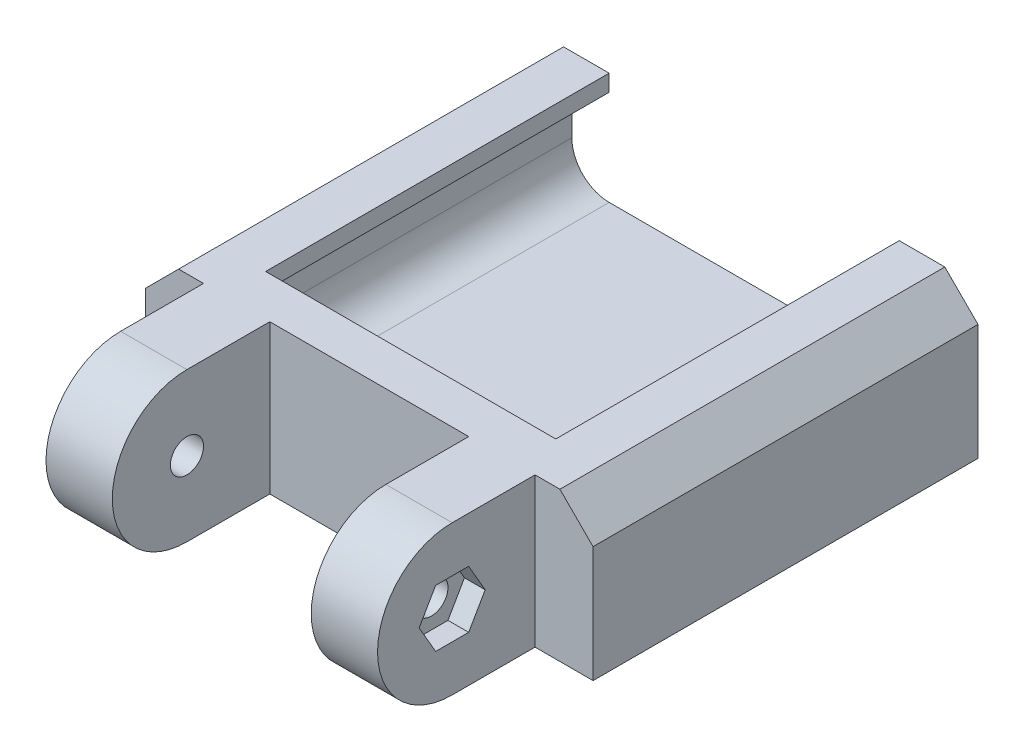
ISO-10303-21;
HEADER;
FILE_DESCRIPTION(('STEP AP214'),'2;1');
FILE_NAME('part.step','',(''),(''),'','','');
FILE_SCHEMA(('AUTOMOTIVE_DESIGN { 1 0 10303 214 1 1 1 1 }'));
ENDSEC;
DATA;
#1=APPLICATION_CONTEXT('core data for automotive mechanical design processes');
#2=APPLICATION_PROTOCOL_DEFINITION('international standard','automotive_design',2000,#1);
#3=PRODUCT_CONTEXT('',#1,'mechanical');
#4=PRODUCT('Part','Part','',(#3));
#5=PRODUCT_RELATED_PRODUCT_CATEGORY('part','',(#4));
#6=PRODUCT_DEFINITION_FORMATION('','',#4);
#7=PRODUCT_DEFINITION_CONTEXT('part definition',#1,'design');
#8=PRODUCT_DEFINITION('design','',#6,#7);
#9=PRODUCT_DEFINITION_SHAPE('','',#8);
#10=(LENGTH_UNIT() NAMED_UNIT(*) SI_UNIT(.MILLI.,.METRE.));
#11=(NAMED_UNIT(*) PLANE_ANGLE_UNIT() SI_UNIT($,.RADIAN.));
#12=(NAMED_UNIT(*) SI_UNIT($,.STERADIAN.) SOLID_ANGLE_UNIT());
#13=UNCERTAINTY_MEASURE_WITH_UNIT(LENGTH_MEASURE(1.E-05),#10,'distance_accuracy_value','');
#14=(GEOMETRIC_REPRESENTATION_CONTEXT(3) GLOBAL_UNCERTAINTY_ASSIGNED_CONTEXT((#13)) GLOBAL_UNIT_ASSIGNED_CONTEXT((#10,
#11,#12)) REPRESENTATION_CONTEXT('',''));
#15=CARTESIAN_POINT('',(0.,0.,0.));
#16=DIRECTION('',(0.,0.,1.));
#17=DIRECTION('',(1.,0.,0.));
#18=AXIS2_PLACEMENT_3D('',#15,#16,#17);
#19=CARTESIAN_POINT('',(-20.,9.49999999999999,48.916410101364));
#20=DIRECTION('',(-1.,0.,0.));
#21=DIRECTION('',(0.,0.,1.));
#22=AXIS2_PLACEMENT_3D('',#19,#20,#21);
#23=CYLINDRICAL_SURFACE('',#22,1.99999999999999);
#24=CARTESIAN_POINT('',(12.,9.49999999999999,48.916410101364));
#25=DIRECTION('',(1.,0.,0.));
#26=DIRECTION('',(0.,1.,0.));
#27=AXIS2_PLACEMENT_3D('',#24,#25,#26);
#28=CIRCLE('',#27,1.99999999999999);
#29=CARTESIAN_POINT('',(12.,11.5,48.916410101364));
#30=VERTEX_POINT('',#29);
#31=EDGE_CURVE('E305',#30,#30,#28,.T.);
#32=ORIENTED_EDGE('',*,*,#31,.F.);
#33=EDGE_LOOP('',(#32));
#34=FACE_BOUND('',#33,.T.);
#35=CARTESIAN_POINT('',(17.5,9.49999999999999,48.916410101364));
#36=DIRECTION('',(1.,0.,0.));
#37=DIRECTION('',(0.,0.,-1.));
#38=AXIS2_PLACEMENT_3D('',#35,#36,#37);
#39=CIRCLE('',#38,1.99999999999999);
#40=CARTESIAN_POINT('',(17.5,9.49999999999999,46.916410101364));
#41=VERTEX_POINT('',#40);
#42=EDGE_CURVE('E49',#41,#41,#39,.F.);
#43=ORIENTED_EDGE('',*,*,#42,.F.);
#44=EDGE_LOOP('',(#43));
#45=FACE_BOUND('',#44,.T.);
#46=ADVANCED_FACE('F45',(#34,#45),#23,.F.);
#47=CARTESIAN_POINT('',(20.,18.5,48.916410101364));
#48=DIRECTION('',(-1.,0.,0.));
#49=DIRECTION('',(0.,-1.,0.));
#50=AXIS2_PLACEMENT_3D('',#47,#48,#49);
#51=PLANE('',#50);
#52=DIRECTION('',(0.,0.866025403784439,0.499999999999999));
#53=VECTOR('',#52,1.);
#54=CARTESIAN_POINT('',(20.,9.49999999999998,44.9326932439556));
#55=LINE('',#54,#53);
#56=CARTESIAN_POINT('',(20.,9.49999999999998,44.9326932439556));
#57=VERTEX_POINT('',#56);
#58=CARTESIAN_POINT('',(20.,12.95,46.9245516726598));
#59=VERTEX_POINT('',#58);
#60=EDGE_CURVE('E279',#57,#59,#55,.T.);
#61=ORIENTED_EDGE('',*,*,#60,.F.);
#62=DIRECTION('',(0.,0.866025403784439,-0.5));
#63=VECTOR('',#62,1.);
#64=CARTESIAN_POINT('',(20.,6.04999999999999,46.9245516726598));
#65=LINE('',#64,#63);
#66=CARTESIAN_POINT('',(20.,6.04999999999999,46.9245516726598));
#67=VERTEX_POINT('',#66);
#68=EDGE_CURVE('E62',#67,#57,#65,.T.);
#69=ORIENTED_EDGE('',*,*,#68,.F.);
#70=DIRECTION('',(0.,0.,-1.));
#71=VECTOR('',#70,1.);
#72=CARTESIAN_POINT('',(20.,6.04999999999999,50.9082685300682));
#73=LINE('',#72,#71);
#74=CARTESIAN_POINT('',(20.,6.04999999999999,50.9082685300682));
#75=VERTEX_POINT('',#74);
#76=EDGE_CURVE('E265',#75,#67,#73,.T.);
#77=ORIENTED_EDGE('',*,*,#76,.F.);
#78=DIRECTION('',(0.,-0.866025403784439,-0.499999999999999));
#79=VECTOR('',#78,1.);
#80=CARTESIAN_POINT('',(20.,9.49999999999999,52.9001269587724));
#81=LINE('',#80,#79);
#82=CARTESIAN_POINT('',(20.,9.49999999999999,52.9001269587724));
#83=VERTEX_POINT('',#82);
#84=EDGE_CURVE('E268',#83,#75,#81,.T.);
#85=ORIENTED_EDGE('',*,*,#84,.F.);
#86=DIRECTION('',(0.,-0.866025403784439,0.499999999999999));
#87=VECTOR('',#86,1.);
#88=CARTESIAN_POINT('',(20.,12.95,50.9082685300682));
#89=LINE('',#88,#87);
#90=CARTESIAN_POINT('',(20.,12.95,50.9082685300682));
#91=VERTEX_POINT('',#90);
#92=EDGE_CURVE('E284',#91,#83,#89,.T.);
#93=ORIENTED_EDGE('',*,*,#92,.F.);
#94=DIRECTION('',(0.,0.,1.));
#95=VECTOR('',#94,1.);
#96=CARTESIAN_POINT('',(20.,12.95,46.9245516726598));
#97=LINE('',#96,#95);
#98=EDGE_CURVE('E281',#59,#91,#97,.T.);
#99=ORIENTED_EDGE('',*,*,#98,.F.);
#100=EDGE_LOOP('',(#61,#69,#77,#85,#93,#99));
#101=FACE_BOUND('',#100,.T.);
#102=DIRECTION('',(0.,1.,0.));
#103=VECTOR('',#102,1.);
#104=CARTESIAN_POINT('',(20.,18.5,38.916410101364));
#105=LINE('',#104,#103);
#106=CARTESIAN_POINT('',(20.,0.5,38.916410101364));
#107=VERTEX_POINT('',#106);
#108=CARTESIAN_POINT('',(20.,18.5,38.916410101364));
#109=VERTEX_POINT('',#108);
#110=EDGE_CURVE('E358',#107,#109,#105,.T.);
#111=ORIENTED_EDGE('',*,*,#110,.T.);
#112=DIRECTION('',(0.,0.,-1.));
#113=VECTOR('',#112,1.);
#114=CARTESIAN_POINT('',(20.,18.5,48.916410101364));
#115=LINE('',#114,#113);
#116=CARTESIAN_POINT('',(20.,18.5,48.916410101364));
#117=VERTEX_POINT('',#116);
#118=EDGE_CURVE('E351',#117,#109,#115,.T.);
#119=ORIENTED_EDGE('',*,*,#118,.F.);
#120=CARTESIAN_POINT('',(20.,9.5,48.916410101364));
#121=DIRECTION('',(1.,0.,0.));
#122=DIRECTION('',(0.,1.,0.));
#123=AXIS2_PLACEMENT_3D('',#120,#121,#122);
#124=CIRCLE('',#123,9.00000000000001);
#125=CARTESIAN_POINT('',(20.,0.5,48.916410101364));
#126=VERTEX_POINT('',#125);
#127=EDGE_CURVE('E312',#117,#126,#124,.T.);
#128=ORIENTED_EDGE('',*,*,#127,.T.);
#129=DIRECTION('',(0.,0.,-1.));
#130=VECTOR('',#129,1.);
#131=CARTESIAN_POINT('',(20.,0.5,48.916410101364));
#132=LINE('',#131,#130);
#133=EDGE_CURVE('E348',#126,#107,#132,.T.);
#134=ORIENTED_EDGE('',*,*,#133,.T.);
#135=EDGE_LOOP('',(#111,#119,#128,#134));
#136=FACE_BOUND('',#135,.T.);
#137=ADVANCED_FACE('F521',(#101,#136),#51,.F.);
#138=CARTESIAN_POINT('',(-30.5,0.,38.916410101364));
#139=DIRECTION('',(0.,0.,-1.));
#140=DIRECTION('',(-1.,0.,0.));
#141=AXIS2_PLACEMENT_3D('',#138,#139,#140);
#142=PLANE('',#141);
#143=DIRECTION('',(0.,-1.,0.));
#144=VECTOR('',#143,1.);
#145=CARTESIAN_POINT('',(-20.,18.5,38.916410101364));
#146=LINE('',#145,#144);
#147=CARTESIAN_POINT('',(-20.,18.5,38.916410101364));
#148=VERTEX_POINT('',#147);
#149=CARTESIAN_POINT('',(-20.,0.5,38.916410101364));
#150=VERTEX_POINT('',#149);
#151=EDGE_CURVE('E329',#148,#150,#146,.T.);
#152=ORIENTED_EDGE('',*,*,#151,.F.);
#153=DIRECTION('',(-1.,0.,0.));
#154=VECTOR('',#153,1.);
#155=CARTESIAN_POINT('',(-27.,18.5,38.916410101364));
#156=LINE('',#155,#154);
#157=CARTESIAN_POINT('',(-23.,18.5,38.916410101364));
#158=VERTEX_POINT('',#157);
#159=EDGE_CURVE('E450',#148,#158,#156,.T.);
#160=ORIENTED_EDGE('',*,*,#159,.T.);
#161=DIRECTION('',(0.707106781186548,0.707106781186548,0.));
#162=VECTOR('',#161,1.);
#163=CARTESIAN_POINT('',(-23.,18.5,38.916410101364));
#164=LINE('',#163,#162);
#165=CARTESIAN_POINT('',(-27.,14.5,38.916410101364));
#166=VERTEX_POINT('',#165);
#167=EDGE_CURVE('E478',#158,#166,#164,.F.);
#168=ORIENTED_EDGE('',*,*,#167,.T.);
#169=DIRECTION('',(0.,-1.,0.));
#170=VECTOR('',#169,1.);
#171=CARTESIAN_POINT('',(-27.,5.,38.916410101364));
#172=LINE('',#171,#170);
#173=CARTESIAN_POINT('',(-27.,0.5,38.916410101364));
#174=VERTEX_POINT('',#173);
#175=EDGE_CURVE('E448',#166,#174,#172,.T.);
#176=ORIENTED_EDGE('',*,*,#175,.T.);
#177=DIRECTION('',(-1.,0.,0.));
#178=VECTOR('',#177,1.);
#179=CARTESIAN_POINT('',(-28.,0.5,38.916410101364));
#180=LINE('',#179,#178);
#181=EDGE_CURVE('E70',#150,#174,#180,.T.);
#182=ORIENTED_EDGE('',*,*,#181,.F.);
#183=EDGE_LOOP('',(#152,#160,#168,#176,#182));
#184=FACE_BOUND('',#183,.T.);
#185=ADVANCED_FACE('F526',(#184),#142,.F.);
#186=DIRECTION('',(0.,1.,0.));
#187=VECTOR('',#186,1.);
#188=CARTESIAN_POINT('',(-12.,18.5,38.916410101364));
#189=LINE('',#188,#187);
#190=CARTESIAN_POINT('',(-12.,0.5,38.916410101364));
#191=VERTEX_POINT('',#190);
#192=CARTESIAN_POINT('',(-12.,18.5,38.916410101364));
#193=VERTEX_POINT('',#192);
#194=EDGE_CURVE('E325',#191,#193,#189,.T.);
#195=ORIENTED_EDGE('',*,*,#194,.F.);
#196=CARTESIAN_POINT('',(12.,0.5,38.916410101364));
#197=VERTEX_POINT('',#196);
#198=EDGE_CURVE('E476',#197,#191,#180,.T.);
#199=ORIENTED_EDGE('',*,*,#198,.F.);
#200=DIRECTION('',(0.,-1.,0.));
#201=VECTOR('',#200,1.);
#202=CARTESIAN_POINT('',(12.,18.5,38.916410101364));
#203=LINE('',#202,#201);
#204=CARTESIAN_POINT('',(12.,18.5,38.916410101364));
#205=VERTEX_POINT('',#204);
#206=EDGE_CURVE('E332',#205,#197,#203,.T.);
#207=ORIENTED_EDGE('',*,*,#206,.F.);
#208=EDGE_CURVE('E449',#205,#193,#156,.T.);
#209=ORIENTED_EDGE('',*,*,#208,.T.);
#210=EDGE_LOOP('',(#195,#199,#207,#209));
#211=FACE_BOUND('',#210,.T.);
#212=ADVANCED_FACE('F662',(#211),#142,.F.);
#213=ORIENTED_EDGE('',*,*,#110,.F.);
#214=CARTESIAN_POINT('',(27.,0.5,38.916410101364));
#215=VERTEX_POINT('',#214);
#216=EDGE_CURVE('E472',#215,#107,#180,.T.);
#217=ORIENTED_EDGE('',*,*,#216,.F.);
#218=DIRECTION('',(0.,1.,0.));
#219=VECTOR('',#218,1.);
#220=CARTESIAN_POINT('',(27.,18.5,38.916410101364));
#221=LINE('',#220,#219);
#222=CARTESIAN_POINT('',(27.,14.5,38.916410101364));
#223=VERTEX_POINT('',#222);
#224=EDGE_CURVE('E464',#215,#223,#221,.T.);
#225=ORIENTED_EDGE('',*,*,#224,.T.);
#226=DIRECTION('',(0.707106781186548,-0.707106781186548,0.));
#227=VECTOR('',#226,1.);
#228=CARTESIAN_POINT('',(27.,14.5,38.916410101364));
#229=LINE('',#228,#227);
#230=CARTESIAN_POINT('',(23.,18.5,38.916410101364));
#231=VERTEX_POINT('',#230);
#232=EDGE_CURVE('E480',#223,#231,#229,.F.);
#233=ORIENTED_EDGE('',*,*,#232,.T.);
#234=EDGE_CURVE('E446',#231,#109,#156,.T.);
#235=ORIENTED_EDGE('',*,*,#234,.T.);
#236=EDGE_LOOP('',(#213,#217,#225,#233,#235));
#237=FACE_BOUND('',#236,.T.);
#238=ADVANCED_FACE('F664',(#237),#142,.F.);
#239=CARTESIAN_POINT('',(0.,5.,0.));
#240=DIRECTION('',(0.,1.,0.));
#241=DIRECTION('',(0.,0.,1.));
#242=AXIS2_PLACEMENT_3D('',#239,#240,#241);
#243=PLANE('',#242);
#244=DIRECTION('',(0.,0.,1.));
#245=VECTOR('',#244,1.);
#246=CARTESIAN_POINT('',(-17.5,5.,38.916410101364));
#247=LINE('',#246,#245);
#248=CARTESIAN_POINT('',(-17.5,5.,-7.52264068711072));
#249=VERTEX_POINT('',#248);
#250=CARTESIAN_POINT('',(-17.5,5.,33.916410101364));
#251=VERTEX_POINT('',#250);
#252=EDGE_CURVE('E492',#249,#251,#247,.T.);
#253=ORIENTED_EDGE('',*,*,#252,.T.);
#254=DIRECTION('',(1.,0.,0.));
#255=VECTOR('',#254,1.);
#256=CARTESIAN_POINT('',(0.,5.,33.916410101364));
#257=LINE('',#256,#255);
#258=CARTESIAN_POINT('',(17.5,5.,33.916410101364));
#259=VERTEX_POINT('',#258);
#260=EDGE_CURVE('E373',#251,#259,#257,.T.);
#261=ORIENTED_EDGE('',*,*,#260,.T.);
#262=DIRECTION('',(0.,0.,1.));
#263=VECTOR('',#262,1.);
#264=CARTESIAN_POINT('',(17.5,5.,2.47735931288928));
#265=LINE('',#264,#263);
#266=CARTESIAN_POINT('',(17.5,5.,-7.52264068711072));
#267=VERTEX_POINT('',#266);
#268=EDGE_CURVE('E490',#259,#267,#265,.F.);
#269=ORIENTED_EDGE('',*,*,#268,.T.);
#270=DIRECTION('',(1.,0.,0.));
#271=VECTOR('',#270,1.);
#272=CARTESIAN_POINT('',(-17.5,5.,-7.52264068711072));
#273=LINE('',#272,#271);
#274=EDGE_CURVE('E423',#249,#267,#273,.T.);
#275=ORIENTED_EDGE('',*,*,#274,.F.);
#276=EDGE_LOOP('',(#253,#261,#269,#275));
#277=FACE_BOUND('',#276,.T.);
#278=ADVANCED_FACE('F681',(#277),#243,.T.);
#279=CARTESIAN_POINT('',(22.,5.,-15.083589898636));
#280=DIRECTION('',(-1.,0.,0.));
#281=DIRECTION('',(0.,0.,1.));
#282=AXIS2_PLACEMENT_3D('',#279,#280,#281);
#283=PLANE('',#282);
#284=DIRECTION('',(0.,0.,1.));
#285=VECTOR('',#284,1.);
#286=CARTESIAN_POINT('',(22.,9.5,38.916410101364));
#287=LINE('',#286,#285);
#288=CARTESIAN_POINT('',(22.,9.5,-7.52264068711072));
#289=VERTEX_POINT('',#288);
#290=CARTESIAN_POINT('',(22.,9.5,33.916410101364));
#291=VERTEX_POINT('',#290);
#292=EDGE_CURVE('E54',#289,#291,#287,.T.);
#293=ORIENTED_EDGE('',*,*,#292,.T.);
#294=DIRECTION('',(0.,1.,0.));
#295=VECTOR('',#294,1.);
#296=CARTESIAN_POINT('',(22.,5.,33.916410101364));
#297=LINE('',#296,#295);
#298=CARTESIAN_POINT('',(22.,16.5,33.916410101364));
#299=VERTEX_POINT('',#298);
#300=EDGE_CURVE('E370',#291,#299,#297,.T.);
#301=ORIENTED_EDGE('',*,*,#300,.T.);
#302=DIRECTION('',(0.,0.,1.));
#303=VECTOR('',#302,1.);
#304=CARTESIAN_POINT('',(22.,16.5,-15.083589898636));
#305=LINE('',#304,#303);
#306=CARTESIAN_POINT('',(22.,16.5,-7.52264068711072));
#307=VERTEX_POINT('',#306);
#308=EDGE_CURVE('E445',#307,#299,#305,.T.);
#309=ORIENTED_EDGE('',*,*,#308,.F.);
#310=DIRECTION('',(0.,1.,0.));
#311=VECTOR('',#310,1.);
#312=CARTESIAN_POINT('',(22.,9.5,-7.52264068711072));
#313=LINE('',#312,#311);
#314=EDGE_CURVE('E429',#289,#307,#313,.T.);
#315=ORIENTED_EDGE('',*,*,#314,.F.);
#316=EDGE_LOOP('',(#293,#301,#309,#315));
#317=FACE_BOUND('',#316,.T.);
#318=ADVANCED_FACE('F702',(#317),#283,.T.);
#319=CARTESIAN_POINT('',(22.,16.5,-15.083589898636));
#320=DIRECTION('',(0.,-1.,0.));
#321=DIRECTION('',(1.,0.,0.));
#322=AXIS2_PLACEMENT_3D('',#319,#320,#321);
#323=PLANE('',#322);
#324=ORIENTED_EDGE('',*,*,#308,.T.);
#325=DIRECTION('',(-1.,0.,0.));
#326=VECTOR('',#325,1.);
#327=CARTESIAN_POINT('',(22.,16.5,33.916410101364));
#328=LINE('',#327,#326);
#329=CARTESIAN_POINT('',(17.5,16.5,33.916410101364));
#330=VERTEX_POINT('',#329);
#331=EDGE_CURVE('E387',#299,#330,#328,.T.);
#332=ORIENTED_EDGE('',*,*,#331,.T.);
#333=DIRECTION('',(0.,0.,1.));
#334=VECTOR('',#333,1.);
#335=CARTESIAN_POINT('',(17.5,16.5,-15.083589898636));
#336=LINE('',#335,#334);
#337=CARTESIAN_POINT('',(17.5,16.5,-7.52264068711072));
#338=VERTEX_POINT('',#337);
#339=EDGE_CURVE('E465',#338,#330,#336,.T.);
#340=ORIENTED_EDGE('',*,*,#339,.F.);
#341=DIRECTION('',(-1.,0.,0.));
#342=VECTOR('',#341,1.);
#343=CARTESIAN_POINT('',(22.,16.5,-7.52264068711072));
#344=LINE('',#343,#342);
#345=EDGE_CURVE('E432',#307,#338,#344,.T.);
#346=ORIENTED_EDGE('',*,*,#345,.F.);
#347=EDGE_LOOP('',(#324,#332,#340,#346));
#348=FACE_BOUND('',#347,.T.);
#349=ADVANCED_FACE('F715',(#348),#323,.T.);
#350=CARTESIAN_POINT('',(17.5,16.5,-15.083589898636));
#351=DIRECTION('',(-1.,0.,0.));
#352=DIRECTION('',(0.,-1.,0.));
#353=AXIS2_PLACEMENT_3D('',#350,#351,#352);
#354=PLANE('',#353);
#355=ORIENTED_EDGE('',*,*,#339,.T.);
#356=DIRECTION('',(0.,1.,0.));
#357=VECTOR('',#356,1.);
#358=CARTESIAN_POINT('',(17.5,16.5,33.916410101364));
#359=LINE('',#358,#357);
#360=CARTESIAN_POINT('',(17.5,18.5,33.916410101364));
#361=VERTEX_POINT('',#360);
#362=EDGE_CURVE('E390',#330,#361,#359,.T.);
#363=ORIENTED_EDGE('',*,*,#362,.T.);
#364=DIRECTION('',(0.,0.,1.));
#365=VECTOR('',#364,1.);
#366=CARTESIAN_POINT('',(17.5,18.5,-15.083589898636));
#367=LINE('',#366,#365);
#368=CARTESIAN_POINT('',(17.5,18.5,-7.52264068711072));
#369=VERTEX_POINT('',#368);
#370=EDGE_CURVE('E461',#369,#361,#367,.T.);
#371=ORIENTED_EDGE('',*,*,#370,.F.);
#372=DIRECTION('',(0.,1.,0.));
#373=VECTOR('',#372,1.);
#374=CARTESIAN_POINT('',(17.5,16.5,-7.52264068711072));
#375=LINE('',#374,#373);
#376=EDGE_CURVE('E435',#338,#369,#375,.T.);
#377=ORIENTED_EDGE('',*,*,#376,.F.);
#378=EDGE_LOOP('',(#355,#363,#371,#377));
#379=FACE_BOUND('',#378,.T.);
#380=ADVANCED_FACE('F727',(#379),#354,.T.);
#381=CARTESIAN_POINT('',(-17.5,18.5,-15.083589898636));
#382=DIRECTION('',(1.,0.,0.));
#383=DIRECTION('',(0.,1.,0.));
#384=AXIS2_PLACEMENT_3D('',#381,#382,#383);
#385=PLANE('',#384);
#386=DIRECTION('',(0.,0.,1.));
#387=VECTOR('',#386,1.);
#388=CARTESIAN_POINT('',(-17.5,18.5,-15.083589898636));
#389=LINE('',#388,#387);
#390=CARTESIAN_POINT('',(-17.5,18.5,-7.52264068711072));
#391=VERTEX_POINT('',#390);
#392=CARTESIAN_POINT('',(-17.5,18.5,33.916410101364));
#393=VERTEX_POINT('',#392);
#394=EDGE_CURVE('E453',#391,#393,#389,.T.);
#395=ORIENTED_EDGE('',*,*,#394,.T.);
#396=DIRECTION('',(0.,-1.,0.));
#397=VECTOR('',#396,1.);
#398=CARTESIAN_POINT('',(-17.5,18.5,33.916410101364));
#399=LINE('',#398,#397);
#400=CARTESIAN_POINT('',(-17.5,16.5,33.916410101364));
#401=VERTEX_POINT('',#400);
#402=EDGE_CURVE('E384',#393,#401,#399,.T.);
#403=ORIENTED_EDGE('',*,*,#402,.T.);
#404=DIRECTION('',(0.,0.,1.));
#405=VECTOR('',#404,1.);
#406=CARTESIAN_POINT('',(-17.5,16.5,-15.083589898636));
#407=LINE('',#406,#405);
#408=CARTESIAN_POINT('',(-17.5,16.5,-7.52264068711072));
#409=VERTEX_POINT('',#408);
#410=EDGE_CURVE('E456',#409,#401,#407,.T.);
#411=ORIENTED_EDGE('',*,*,#410,.F.);
#412=DIRECTION('',(0.,-1.,0.));
#413=VECTOR('',#412,1.);
#414=CARTESIAN_POINT('',(-17.5,18.5,-7.52264068711072));
#415=LINE('',#414,#413);
#416=EDGE_CURVE('E411',#391,#409,#415,.T.);
#417=ORIENTED_EDGE('',*,*,#416,.F.);
#418=EDGE_LOOP('',(#395,#403,#411,#417));
#419=FACE_BOUND('',#418,.T.);
#420=ADVANCED_FACE('F738',(#419),#385,.T.);
#421=CARTESIAN_POINT('',(-17.5,16.5,-15.083589898636));
#422=DIRECTION('',(0.,-1.,0.));
#423=DIRECTION('',(1.,0.,0.));
#424=AXIS2_PLACEMENT_3D('',#421,#422,#423);
#425=PLANE('',#424);
#426=ORIENTED_EDGE('',*,*,#410,.T.);
#427=DIRECTION('',(-1.,0.,0.));
#428=VECTOR('',#427,1.);
#429=CARTESIAN_POINT('',(-17.5,16.5,33.916410101364));
#430=LINE('',#429,#428);
#431=CARTESIAN_POINT('',(-22.,16.5,33.916410101364));
#432=VERTEX_POINT('',#431);
#433=EDGE_CURVE('E381',#401,#432,#430,.T.);
#434=ORIENTED_EDGE('',*,*,#433,.T.);
#435=DIRECTION('',(0.,0.,1.));
#436=VECTOR('',#435,1.);
#437=CARTESIAN_POINT('',(-22.,16.5,-15.083589898636));
#438=LINE('',#437,#436);
#439=CARTESIAN_POINT('',(-22.,16.5,-7.52264068711072));
#440=VERTEX_POINT('',#439);
#441=EDGE_CURVE('E452',#440,#432,#438,.T.);
#442=ORIENTED_EDGE('',*,*,#441,.F.);
#443=DIRECTION('',(-1.,0.,0.));
#444=VECTOR('',#443,1.);
#445=CARTESIAN_POINT('',(-17.5,16.5,-7.52264068711072));
#446=LINE('',#445,#444);
#447=EDGE_CURVE('E414',#409,#440,#446,.T.);
#448=ORIENTED_EDGE('',*,*,#447,.F.);
#449=EDGE_LOOP('',(#426,#434,#442,#448));
#450=FACE_BOUND('',#449,.T.);
#451=ADVANCED_FACE('F749',(#450),#425,.T.);
#452=CARTESIAN_POINT('',(-22.,5.,-15.083589898636));
#453=DIRECTION('',(1.,0.,0.));
#454=DIRECTION('',(0.,1.,0.));
#455=AXIS2_PLACEMENT_3D('',#452,#453,#454);
#456=PLANE('',#455);
#457=ORIENTED_EDGE('',*,*,#441,.T.);
#458=DIRECTION('',(0.,-1.,0.));
#459=VECTOR('',#458,1.);
#460=CARTESIAN_POINT('',(-22.,5.,33.916410101364));
#461=LINE('',#460,#459);
#462=CARTESIAN_POINT('',(-22.,9.5,33.916410101364));
#463=VERTEX_POINT('',#462);
#464=EDGE_CURVE('E378',#432,#463,#461,.T.);
#465=ORIENTED_EDGE('',*,*,#464,.T.);
#466=DIRECTION('',(0.,0.,1.));
#467=VECTOR('',#466,1.);
#468=CARTESIAN_POINT('',(-22.,9.5,2.47735931288928));
#469=LINE('',#468,#467);
#470=CARTESIAN_POINT('',(-22.,9.5,-7.52264068711072));
#471=VERTEX_POINT('',#470);
#472=EDGE_CURVE('E495',#463,#471,#469,.F.);
#473=ORIENTED_EDGE('',*,*,#472,.T.);
#474=DIRECTION('',(0.,-1.,0.));
#475=VECTOR('',#474,1.);
#476=CARTESIAN_POINT('',(-22.,16.5,-7.52264068711072));
#477=LINE('',#476,#475);
#478=EDGE_CURVE('E417',#440,#471,#477,.T.);
#479=ORIENTED_EDGE('',*,*,#478,.F.);
#480=EDGE_LOOP('',(#457,#465,#473,#479));
#481=FACE_BOUND('',#480,.T.);
#482=ADVANCED_FACE('F760',(#481),#456,.T.);
#483=CARTESIAN_POINT('',(-17.5,9.5,0.));
#484=DIRECTION('',(0.,0.,-1.));
#485=DIRECTION('',(-1.,0.,0.));
#486=AXIS2_PLACEMENT_3D('',#483,#484,#485);
#487=CYLINDRICAL_SURFACE('',#486,4.5);
#488=CARTESIAN_POINT('',(-17.5,9.5,33.916410101364));
#489=DIRECTION('',(0.,0.,1.));
#490=DIRECTION('',(1.,0.,0.));
#491=AXIS2_PLACEMENT_3D('',#488,#489,#490);
#492=CIRCLE('',#491,4.5);
#493=EDGE_CURVE('E376',#251,#463,#492,.F.);
#494=ORIENTED_EDGE('',*,*,#493,.F.);
#495=ORIENTED_EDGE('',*,*,#252,.F.);
#496=CARTESIAN_POINT('',(-17.5,9.5,-7.52264068711072));
#497=DIRECTION('',(0.,0.,1.));
#498=DIRECTION('',(-1.,0.,0.));
#499=AXIS2_PLACEMENT_3D('',#496,#497,#498);
#500=CIRCLE('',#499,4.5);
#501=EDGE_CURVE('E420',#471,#249,#500,.T.);
#502=ORIENTED_EDGE('',*,*,#501,.F.);
#503=ORIENTED_EDGE('',*,*,#472,.F.);
#504=EDGE_LOOP('',(#494,#495,#502,#503));
#505=FACE_BOUND('',#504,.T.);
#506=ADVANCED_FACE('F771',(#505),#487,.F.);
#507=CARTESIAN_POINT('',(17.5,9.5,-15.083589898636));
#508=DIRECTION('',(0.,0.,-1.));
#509=DIRECTION('',(-1.,0.,0.));
#510=AXIS2_PLACEMENT_3D('',#507,#508,#509);
#511=CYLINDRICAL_SURFACE('',#510,4.5);
#512=CARTESIAN_POINT('',(17.5,9.5,33.916410101364));
#513=DIRECTION('',(0.,0.,1.));
#514=DIRECTION('',(1.,0.,0.));
#515=AXIS2_PLACEMENT_3D('',#512,#513,#514);
#516=CIRCLE('',#515,4.5);
#517=EDGE_CURVE('E11',#291,#259,#516,.F.);
#518=ORIENTED_EDGE('',*,*,#517,.F.);
#519=ORIENTED_EDGE('',*,*,#292,.F.);
#520=CARTESIAN_POINT('',(17.5,9.5,-7.52264068711072));
#521=DIRECTION('',(0.,0.,1.));
#522=DIRECTION('',(-1.,0.,0.));
#523=AXIS2_PLACEMENT_3D('',#520,#521,#522);
#524=CIRCLE('',#523,4.5);
#525=EDGE_CURVE('E426',#267,#289,#524,.T.);
#526=ORIENTED_EDGE('',*,*,#525,.F.);
#527=ORIENTED_EDGE('',*,*,#268,.F.);
#528=EDGE_LOOP('',(#518,#519,#526,#527));
#529=FACE_BOUND('',#528,.T.);
#530=ADVANCED_FACE('F47',(#529),#511,.F.);
#531=CARTESIAN_POINT('',(27.,18.5,-15.083589898636));
#532=DIRECTION('',(1.,0.,0.));
#533=DIRECTION('',(0.,1.,0.));
#534=AXIS2_PLACEMENT_3D('',#531,#532,#533);
#535=PLANE('',#534);
#536=ORIENTED_EDGE('',*,*,#224,.F.);
#537=DIRECTION('',(0.,0.,1.));
#538=VECTOR('',#537,1.);
#539=CARTESIAN_POINT('',(27.,0.5,0.));
#540=LINE('',#539,#538);
#541=CARTESIAN_POINT('',(27.,0.5,-7.52264068711072));
#542=VERTEX_POINT('',#541);
#543=EDGE_CURVE('E441',#542,#215,#540,.T.);
#544=ORIENTED_EDGE('',*,*,#543,.F.);
#545=DIRECTION('',(0.,-1.,0.));
#546=VECTOR('',#545,1.);
#547=CARTESIAN_POINT('',(27.,14.5,-7.52264068711072));
#548=LINE('',#547,#546);
#549=CARTESIAN_POINT('',(27.,14.5,-7.52264068711072));
#550=VERTEX_POINT('',#549);
#551=EDGE_CURVE('E396',#550,#542,#548,.T.);
#552=ORIENTED_EDGE('',*,*,#551,.F.);
#553=DIRECTION('',(0.,0.,1.));
#554=VECTOR('',#553,1.);
#555=CARTESIAN_POINT('',(27.,14.5,-15.083589898636));
#556=LINE('',#555,#554);
#557=EDGE_CURVE('E475',#550,#223,#556,.T.);
#558=ORIENTED_EDGE('',*,*,#557,.T.);
#559=EDGE_LOOP('',(#536,#544,#552,#558));
#560=FACE_BOUND('',#559,.T.);
#561=ADVANCED_FACE('F791',(#560),#535,.T.);
#562=CARTESIAN_POINT('',(-27.,5.,-15.083589898636));
#563=DIRECTION('',(-1.,0.,0.));
#564=DIRECTION('',(0.,0.,1.));
#565=AXIS2_PLACEMENT_3D('',#562,#563,#564);
#566=PLANE('',#565);
#567=DIRECTION('',(0.,0.,-1.));
#568=VECTOR('',#567,1.);
#569=CARTESIAN_POINT('',(-27.,14.5,-15.083589898636));
#570=LINE('',#569,#568);
#571=CARTESIAN_POINT('',(-27.,14.5,-7.52264068711072));
#572=VERTEX_POINT('',#571);
#573=EDGE_CURVE('E488',#166,#572,#570,.T.);
#574=ORIENTED_EDGE('',*,*,#573,.T.);
#575=DIRECTION('',(0.,1.,0.));
#576=VECTOR('',#575,1.);
#577=CARTESIAN_POINT('',(-27.,0.5,-7.52264068711072));
#578=LINE('',#577,#576);
#579=CARTESIAN_POINT('',(-27.,0.5,-7.52264068711072));
#580=VERTEX_POINT('',#579);
#581=EDGE_CURVE('E402',#580,#572,#578,.T.);
#582=ORIENTED_EDGE('',*,*,#581,.F.);
#583=DIRECTION('',(0.,0.,-1.));
#584=VECTOR('',#583,1.);
#585=CARTESIAN_POINT('',(-27.,0.5,0.));
#586=LINE('',#585,#584);
#587=EDGE_CURVE('E443',#174,#580,#586,.T.);
#588=ORIENTED_EDGE('',*,*,#587,.F.);
#589=ORIENTED_EDGE('',*,*,#175,.F.);
#590=EDGE_LOOP('',(#574,#582,#588,#589));
#591=FACE_BOUND('',#590,.T.);
#592=ADVANCED_FACE('F811',(#591),#566,.T.);
#593=CARTESIAN_POINT('',(0.,0.5,0.));
#594=DIRECTION('',(0.,-1.,0.));
#595=DIRECTION('',(0.,0.,-1.));
#596=AXIS2_PLACEMENT_3D('',#593,#594,#595);
#597=PLANE('',#596);
#598=ORIENTED_EDGE('',*,*,#587,.T.);
#599=DIRECTION('',(-1.,0.,0.));
#600=VECTOR('',#599,1.);
#601=CARTESIAN_POINT('',(27.,0.5,-7.52264068711072));
#602=LINE('',#601,#600);
#603=EDGE_CURVE('E399',#542,#580,#602,.T.);
#604=ORIENTED_EDGE('',*,*,#603,.F.);
#605=ORIENTED_EDGE('',*,*,#543,.T.);
#606=ORIENTED_EDGE('',*,*,#216,.T.);
#607=ORIENTED_EDGE('',*,*,#133,.F.);
#608=DIRECTION('',(1.,0.,0.));
#609=VECTOR('',#608,1.);
#610=CARTESIAN_POINT('',(12.,0.5,48.916410101364));
#611=LINE('',#610,#609);
#612=CARTESIAN_POINT('',(12.,0.5,48.916410101364));
#613=VERTEX_POINT('',#612);
#614=EDGE_CURVE('E361',#613,#126,#611,.T.);
#615=ORIENTED_EDGE('',*,*,#614,.F.);
#616=DIRECTION('',(0.,0.,-1.));
#617=VECTOR('',#616,1.);
#618=CARTESIAN_POINT('',(12.,0.5,48.916410101364));
#619=LINE('',#618,#617);
#620=EDGE_CURVE('E318',#613,#197,#619,.T.);
#621=ORIENTED_EDGE('',*,*,#620,.T.);
#622=ORIENTED_EDGE('',*,*,#198,.T.);
#623=DIRECTION('',(0.,0.,-1.));
#624=VECTOR('',#623,1.);
#625=CARTESIAN_POINT('',(-12.,0.5,48.916410101364));
#626=LINE('',#625,#624);
#627=CARTESIAN_POINT('',(-12.,0.5,48.916410101364));
#628=VERTEX_POINT('',#627);
#629=EDGE_CURVE('E340',#628,#191,#626,.T.);
#630=ORIENTED_EDGE('',*,*,#629,.F.);
#631=DIRECTION('',(1.,0.,0.));
#632=VECTOR('',#631,1.);
#633=CARTESIAN_POINT('',(-20.,0.5,48.916410101364));
#634=LINE('',#633,#632);
#635=CARTESIAN_POINT('',(-20.,0.49999999999999,48.916410101364));
#636=VERTEX_POINT('',#635);
#637=EDGE_CURVE('E321',#636,#628,#634,.T.);
#638=ORIENTED_EDGE('',*,*,#637,.F.);
#639=DIRECTION('',(0.,0.,-1.));
#640=VECTOR('',#639,1.);
#641=CARTESIAN_POINT('',(-20.,0.5,48.916410101364));
#642=LINE('',#641,#640);
#643=EDGE_CURVE('E343',#636,#150,#642,.T.);
#644=ORIENTED_EDGE('',*,*,#643,.T.);
#645=ORIENTED_EDGE('',*,*,#181,.T.);
#646=EDGE_LOOP('',(#598,#604,#605,#606,#607,#615,#621,#622,#630,#638,#644,#645));
#647=FACE_BOUND('',#646,.T.);
#648=ADVANCED_FACE('F825',(#647),#597,.T.);
#649=CARTESIAN_POINT('',(-27.,18.5,-15.083589898636));
#650=DIRECTION('',(0.,1.,0.));
#651=DIRECTION('',(0.,0.,1.));
#652=AXIS2_PLACEMENT_3D('',#649,#650,#651);
#653=PLANE('',#652);
#654=DIRECTION('',(-1.,0.,0.));
#655=VECTOR('',#654,1.);
#656=CARTESIAN_POINT('',(23.,18.5,33.916410101364));
#657=LINE('',#656,#655);
#658=EDGE_CURVE('E345',#361,#393,#657,.T.);
#659=ORIENTED_EDGE('',*,*,#658,.T.);
#660=ORIENTED_EDGE('',*,*,#394,.F.);
#661=DIRECTION('',(1.,0.,0.));
#662=VECTOR('',#661,1.);
#663=CARTESIAN_POINT('',(-23.,18.5,-7.52264068711072));
#664=LINE('',#663,#662);
#665=CARTESIAN_POINT('',(-23.,18.5,-7.52264068711072));
#666=VERTEX_POINT('',#665);
#667=EDGE_CURVE('E408',#666,#391,#664,.T.);
#668=ORIENTED_EDGE('',*,*,#667,.F.);
#669=DIRECTION('',(0.,0.,1.));
#670=VECTOR('',#669,1.);
#671=CARTESIAN_POINT('',(-23.,18.5,-15.083589898636));
#672=LINE('',#671,#670);
#673=EDGE_CURVE('E485',#666,#158,#672,.T.);
#674=ORIENTED_EDGE('',*,*,#673,.T.);
#675=ORIENTED_EDGE('',*,*,#159,.F.);
#676=DIRECTION('',(0.,0.,-1.));
#677=VECTOR('',#676,1.);
#678=CARTESIAN_POINT('',(-20.,18.5,48.916410101364));
#679=LINE('',#678,#677);
#680=CARTESIAN_POINT('',(-20.,18.5,48.916410101364));
#681=VERTEX_POINT('',#680);
#682=EDGE_CURVE('E328',#681,#148,#679,.T.);
#683=ORIENTED_EDGE('',*,*,#682,.F.);
#684=DIRECTION('',(-1.,0.,0.));
#685=VECTOR('',#684,1.);
#686=CARTESIAN_POINT('',(-20.,18.5,48.916410101364));
#687=LINE('',#686,#685);
#688=CARTESIAN_POINT('',(-12.,18.5,48.916410101364));
#689=VERTEX_POINT('',#688);
#690=EDGE_CURVE('E324',#689,#681,#687,.T.);
#691=ORIENTED_EDGE('',*,*,#690,.F.);
#692=DIRECTION('',(0.,0.,-1.));
#693=VECTOR('',#692,1.);
#694=CARTESIAN_POINT('',(-12.,18.5,48.916410101364));
#695=LINE('',#694,#693);
#696=EDGE_CURVE('E337',#689,#193,#695,.T.);
#697=ORIENTED_EDGE('',*,*,#696,.T.);
#698=ORIENTED_EDGE('',*,*,#208,.F.);
#699=DIRECTION('',(0.,0.,-1.));
#700=VECTOR('',#699,1.);
#701=CARTESIAN_POINT('',(12.,18.5,48.916410101364));
#702=LINE('',#701,#700);
#703=CARTESIAN_POINT('',(12.,18.5,48.916410101364));
#704=VERTEX_POINT('',#703);
#705=EDGE_CURVE('E354',#704,#205,#702,.T.);
#706=ORIENTED_EDGE('',*,*,#705,.F.);
#707=DIRECTION('',(-1.,0.,0.));
#708=VECTOR('',#707,1.);
#709=CARTESIAN_POINT('',(12.,18.5,48.916410101364));
#710=LINE('',#709,#708);
#711=EDGE_CURVE('E357',#117,#704,#710,.T.);
#712=ORIENTED_EDGE('',*,*,#711,.F.);
#713=ORIENTED_EDGE('',*,*,#118,.T.);
#714=ORIENTED_EDGE('',*,*,#234,.F.);
#715=DIRECTION('',(0.,0.,-1.));
#716=VECTOR('',#715,1.);
#717=CARTESIAN_POINT('',(23.,18.5,-15.083589898636));
#718=LINE('',#717,#716);
#719=CARTESIAN_POINT('',(23.,18.5,-7.52264068711072));
#720=VERTEX_POINT('',#719);
#721=EDGE_CURVE('E483',#231,#720,#718,.T.);
#722=ORIENTED_EDGE('',*,*,#721,.T.);
#723=DIRECTION('',(1.,0.,0.));
#724=VECTOR('',#723,1.);
#725=CARTESIAN_POINT('',(17.5,18.5,-7.52264068711072));
#726=LINE('',#725,#724);
#727=EDGE_CURVE('E438',#369,#720,#726,.T.);
#728=ORIENTED_EDGE('',*,*,#727,.F.);
#729=ORIENTED_EDGE('',*,*,#370,.T.);
#730=EDGE_LOOP('',(#659,#660,#668,#674,#675,#683,#691,#697,#698,#706,#712,#713,#714,#722,#728,#729));
#731=FACE_BOUND('',#730,.T.);
#732=ADVANCED_FACE('F840',(#731),#653,.T.);
#733=CARTESIAN_POINT('',(27.,14.5,-15.083589898636));
#734=DIRECTION('',(-0.707106781186548,-0.707106781186548,0.));
#735=DIRECTION('',(0.,0.,1.));
#736=AXIS2_PLACEMENT_3D('',#733,#734,#735);
#737=PLANE('',#736);
#738=ORIENTED_EDGE('',*,*,#232,.F.);
#739=ORIENTED_EDGE('',*,*,#557,.F.);
#740=DIRECTION('',(0.707106781186547,-0.707106781186547,0.));
#741=VECTOR('',#740,1.);
#742=CARTESIAN_POINT('',(23.,18.5,-7.52264068711072));
#743=LINE('',#742,#741);
#744=EDGE_CURVE('E393',#720,#550,#743,.T.);
#745=ORIENTED_EDGE('',*,*,#744,.F.);
#746=ORIENTED_EDGE('',*,*,#721,.F.);
#747=EDGE_LOOP('',(#738,#739,#745,#746));
#748=FACE_BOUND('',#747,.T.);
#749=ADVANCED_FACE('F851',(#748),#737,.F.);
#750=CARTESIAN_POINT('',(-23.,18.5,-15.083589898636));
#751=DIRECTION('',(0.707106781186547,-0.707106781186547,0.));
#752=DIRECTION('',(0.,0.,1.));
#753=AXIS2_PLACEMENT_3D('',#750,#751,#752);
#754=PLANE('',#753);
#755=ORIENTED_EDGE('',*,*,#167,.F.);
#756=ORIENTED_EDGE('',*,*,#673,.F.);
#757=DIRECTION('',(0.707106781186547,0.707106781186547,0.));
#758=VECTOR('',#757,1.);
#759=CARTESIAN_POINT('',(-27.,14.5,-7.52264068711072));
#760=LINE('',#759,#758);
#761=EDGE_CURVE('E405',#572,#666,#760,.T.);
#762=ORIENTED_EDGE('',*,*,#761,.F.);
#763=ORIENTED_EDGE('',*,*,#573,.F.);
#764=EDGE_LOOP('',(#755,#756,#762,#763));
#765=FACE_BOUND('',#764,.T.);
#766=ADVANCED_FACE('F801',(#765),#754,.F.);
#767=CARTESIAN_POINT('',(-17.5,9.5,-7.52264068711072));
#768=DIRECTION('',(0.,0.,-1.));
#769=DIRECTION('',(-1.,0.,0.));
#770=AXIS2_PLACEMENT_3D('',#767,#768,#769);
#771=PLANE('',#770);
#772=ORIENTED_EDGE('',*,*,#744,.T.);
#773=ORIENTED_EDGE('',*,*,#551,.T.);
#774=ORIENTED_EDGE('',*,*,#603,.T.);
#775=ORIENTED_EDGE('',*,*,#581,.T.);
#776=ORIENTED_EDGE('',*,*,#761,.T.);
#777=ORIENTED_EDGE('',*,*,#667,.T.);
#778=ORIENTED_EDGE('',*,*,#416,.T.);
#779=ORIENTED_EDGE('',*,*,#447,.T.);
#780=ORIENTED_EDGE('',*,*,#478,.T.);
#781=ORIENTED_EDGE('',*,*,#501,.T.);
#782=ORIENTED_EDGE('',*,*,#274,.T.);
#783=ORIENTED_EDGE('',*,*,#525,.T.);
#784=ORIENTED_EDGE('',*,*,#314,.T.);
#785=ORIENTED_EDGE('',*,*,#345,.T.);
#786=ORIENTED_EDGE('',*,*,#376,.T.);
#787=ORIENTED_EDGE('',*,*,#727,.T.);
#788=EDGE_LOOP('',(#772,#773,#774,#775,#776,#777,#778,#779,#780,#781,#782,#783,#784,#785,#786,#787));
#789=FACE_BOUND('',#788,.T.);
#790=ADVANCED_FACE('F691',(#789),#771,.T.);
#791=CARTESIAN_POINT('',(0.,0.,33.916410101364));
#792=DIRECTION('',(0.,0.,1.));
#793=DIRECTION('',(1.,0.,0.));
#794=AXIS2_PLACEMENT_3D('',#791,#792,#793);
#795=PLANE('',#794);
#796=ORIENTED_EDGE('',*,*,#362,.F.);
#797=ORIENTED_EDGE('',*,*,#331,.F.);
#798=ORIENTED_EDGE('',*,*,#300,.F.);
#799=ORIENTED_EDGE('',*,*,#517,.T.);
#800=ORIENTED_EDGE('',*,*,#260,.F.);
#801=ORIENTED_EDGE('',*,*,#493,.T.);
#802=ORIENTED_EDGE('',*,*,#464,.F.);
#803=ORIENTED_EDGE('',*,*,#433,.F.);
#804=ORIENTED_EDGE('',*,*,#402,.F.);
#805=ORIENTED_EDGE('',*,*,#658,.F.);
#806=EDGE_LOOP('',(#796,#797,#798,#799,#800,#801,#802,#803,#804,#805));
#807=FACE_BOUND('',#806,.T.);
#808=ADVANCED_FACE('F652',(#807),#795,.F.);
#809=CARTESIAN_POINT('',(12.,18.5,48.916410101364));
#810=DIRECTION('',(1.,0.,0.));
#811=DIRECTION('',(0.,1.,0.));
#812=AXIS2_PLACEMENT_3D('',#809,#810,#811);
#813=PLANE('',#812);
#814=ORIENTED_EDGE('',*,*,#31,.T.);
#815=EDGE_LOOP('',(#814));
#816=FACE_BOUND('',#815,.T.);
#817=ORIENTED_EDGE('',*,*,#206,.T.);
#818=ORIENTED_EDGE('',*,*,#620,.F.);
#819=CARTESIAN_POINT('',(12.,9.5,48.916410101364));
#820=DIRECTION('',(1.,0.,0.));
#821=DIRECTION('',(0.,1.,0.));
#822=AXIS2_PLACEMENT_3D('',#819,#820,#821);
#823=CIRCLE('',#822,9.00000000000001);
#824=EDGE_CURVE('E315',#704,#613,#823,.T.);
#825=ORIENTED_EDGE('',*,*,#824,.F.);
#826=ORIENTED_EDGE('',*,*,#705,.T.);
#827=EDGE_LOOP('',(#817,#818,#825,#826));
#828=FACE_BOUND('',#827,.T.);
#829=ADVANCED_FACE('F643',(#816,#828),#813,.F.);
#830=CARTESIAN_POINT('',(-20.,18.5,48.916410101364));
#831=DIRECTION('',(1.,0.,0.));
#832=DIRECTION('',(0.,1.,0.));
#833=AXIS2_PLACEMENT_3D('',#830,#831,#832);
#834=PLANE('',#833);
#835=CARTESIAN_POINT('',(-20.,9.49999999999999,48.916410101364));
#836=DIRECTION('',(-1.,0.,0.));
#837=DIRECTION('',(0.,0.,1.));
#838=AXIS2_PLACEMENT_3D('',#835,#836,#837);
#839=CIRCLE('',#838,3.75);
#840=CARTESIAN_POINT('',(-20.,9.49999999999999,52.666410101364));
#841=VERTEX_POINT('',#840);
#842=EDGE_CURVE('E298',#841,#841,#839,.T.);
#843=ORIENTED_EDGE('',*,*,#842,.F.);
#844=EDGE_LOOP('',(#843));
#845=FACE_BOUND('',#844,.T.);
#846=ORIENTED_EDGE('',*,*,#151,.T.);
#847=ORIENTED_EDGE('',*,*,#643,.F.);
#848=CARTESIAN_POINT('',(-20.,9.49999999999999,48.916410101364));
#849=DIRECTION('',(1.,0.,0.));
#850=DIRECTION('',(0.,1.,0.));
#851=AXIS2_PLACEMENT_3D('',#848,#849,#850);
#852=CIRCLE('',#851,9.00000000000001);
#853=EDGE_CURVE('E308',#681,#636,#852,.T.);
#854=ORIENTED_EDGE('',*,*,#853,.F.);
#855=ORIENTED_EDGE('',*,*,#682,.T.);
#856=EDGE_LOOP('',(#846,#847,#854,#855));
#857=FACE_BOUND('',#856,.T.);
#858=ADVANCED_FACE('F635',(#845,#857),#834,.F.);
#859=CARTESIAN_POINT('',(-12.,18.5,48.916410101364));
#860=DIRECTION('',(-1.,0.,0.));
#861=DIRECTION('',(0.,-1.,0.));
#862=AXIS2_PLACEMENT_3D('',#859,#860,#861);
#863=PLANE('',#862);
#864=CARTESIAN_POINT('',(-12.,9.49999999999999,48.916410101364));
#865=DIRECTION('',(-1.,0.,0.));
#866=DIRECTION('',(0.,-1.,0.));
#867=AXIS2_PLACEMENT_3D('',#864,#865,#866);
#868=CIRCLE('',#867,1.99999999999999);
#869=CARTESIAN_POINT('',(-12.,7.5,48.916410101364));
#870=VERTEX_POINT('',#869);
#871=EDGE_CURVE('E304',#870,#870,#868,.T.);
#872=ORIENTED_EDGE('',*,*,#871,.T.);
#873=EDGE_LOOP('',(#872));
#874=FACE_BOUND('',#873,.T.);
#875=ORIENTED_EDGE('',*,*,#194,.T.);
#876=ORIENTED_EDGE('',*,*,#696,.F.);
#877=CARTESIAN_POINT('',(-12.,9.5,48.916410101364));
#878=DIRECTION('',(1.,0.,0.));
#879=DIRECTION('',(0.,1.,0.));
#880=AXIS2_PLACEMENT_3D('',#877,#878,#879);
#881=CIRCLE('',#880,9.00000000000001);
#882=EDGE_CURVE('E309',#689,#628,#881,.T.);
#883=ORIENTED_EDGE('',*,*,#882,.T.);
#884=ORIENTED_EDGE('',*,*,#629,.T.);
#885=EDGE_LOOP('',(#875,#876,#883,#884));
#886=FACE_BOUND('',#885,.T.);
#887=ADVANCED_FACE('F501',(#874,#886),#863,.F.);
#888=CARTESIAN_POINT('',(12.,9.5,48.916410101364));
#889=DIRECTION('',(1.,0.,0.));
#890=DIRECTION('',(0.,1.,0.));
#891=AXIS2_PLACEMENT_3D('',#888,#889,#890);
#892=CYLINDRICAL_SURFACE('',#891,9.00000000000001);
#893=ORIENTED_EDGE('',*,*,#127,.F.);
#894=ORIENTED_EDGE('',*,*,#711,.T.);
#895=ORIENTED_EDGE('',*,*,#824,.T.);
#896=ORIENTED_EDGE('',*,*,#614,.T.);
#897=EDGE_LOOP('',(#893,#894,#895,#896));
#898=FACE_BOUND('',#897,.T.);
#899=ADVANCED_FACE('F517',(#898),#892,.T.);
#900=CARTESIAN_POINT('',(-12.,9.5,48.916410101364));
#901=DIRECTION('',(-1.,0.,0.));
#902=DIRECTION('',(0.,-1.,0.));
#903=AXIS2_PLACEMENT_3D('',#900,#901,#902);
#904=CYLINDRICAL_SURFACE('',#903,9.00000000000001);
#905=ORIENTED_EDGE('',*,*,#853,.T.);
#906=ORIENTED_EDGE('',*,*,#637,.T.);
#907=ORIENTED_EDGE('',*,*,#882,.F.);
#908=ORIENTED_EDGE('',*,*,#690,.T.);
#909=EDGE_LOOP('',(#905,#906,#907,#908));
#910=FACE_BOUND('',#909,.T.);
#911=ADVANCED_FACE('F507',(#910),#904,.T.);
#912=CARTESIAN_POINT('',(-18.25,9.49999999999999,48.916410101364));
#913=DIRECTION('',(-1.,0.,0.));
#914=DIRECTION('',(0.,0.,1.));
#915=AXIS2_PLACEMENT_3D('',#912,#913,#914);
#916=CIRCLE('',#915,2.);
#917=CARTESIAN_POINT('',(-18.25,9.49999999999999,50.916410101364));
#918=VERTEX_POINT('',#917);
#919=EDGE_CURVE('E301',#918,#918,#916,.T.);
#920=ORIENTED_EDGE('',*,*,#919,.T.);
#921=EDGE_LOOP('',(#920));
#922=FACE_BOUND('',#921,.T.);
#923=ORIENTED_EDGE('',*,*,#871,.F.);
#924=EDGE_LOOP('',(#923));
#925=FACE_BOUND('',#924,.T.);
#926=ADVANCED_FACE('F504',(#922,#925),#23,.F.);
#927=CARTESIAN_POINT('',(-20.,9.49999999999999,48.916410101364));
#928=DIRECTION('',(-1.,0.,0.));
#929=DIRECTION('',(0.,0.,1.));
#930=AXIS2_PLACEMENT_3D('',#927,#928,#929);
#931=CONICAL_SURFACE('',#930,3.75,0.785398163397447);
#932=ORIENTED_EDGE('',*,*,#919,.F.);
#933=EDGE_LOOP('',(#932));
#934=FACE_BOUND('',#933,.T.);
#935=ORIENTED_EDGE('',*,*,#842,.T.);
#936=EDGE_LOOP('',(#935));
#937=FACE_BOUND('',#936,.T.);
#938=ADVANCED_FACE('F506',(#934,#937),#931,.F.);
#939=CARTESIAN_POINT('',(17.5,0.,0.));
#940=DIRECTION('',(1.,0.,0.));
#941=DIRECTION('',(0.,0.,-1.));
#942=AXIS2_PLACEMENT_3D('',#939,#940,#941);
#943=PLANE('',#942);
#944=DIRECTION('',(0.,0.866025403784439,-0.5));
#945=VECTOR('',#944,1.);
#946=CARTESIAN_POINT('',(17.5,6.04999999999999,46.9245516726598));
#947=LINE('',#946,#945);
#948=CARTESIAN_POINT('',(17.5,6.04999999999999,46.9245516726598));
#949=VERTEX_POINT('',#948);
#950=CARTESIAN_POINT('',(17.5,9.49999999999998,44.9326932439556));
#951=VERTEX_POINT('',#950);
#952=EDGE_CURVE('E245',#949,#951,#947,.T.);
#953=ORIENTED_EDGE('',*,*,#952,.T.);
#954=DIRECTION('',(0.,0.866025403784439,0.499999999999999));
#955=VECTOR('',#954,1.);
#956=CARTESIAN_POINT('',(17.5,9.49999999999998,44.9326932439556));
#957=LINE('',#956,#955);
#958=CARTESIAN_POINT('',(17.5,12.95,46.9245516726598));
#959=VERTEX_POINT('',#958);
#960=EDGE_CURVE('E254',#951,#959,#957,.T.);
#961=ORIENTED_EDGE('',*,*,#960,.T.);
#962=DIRECTION('',(0.,0.,1.));
#963=VECTOR('',#962,1.);
#964=CARTESIAN_POINT('',(17.5,12.95,46.9245516726598));
#965=LINE('',#964,#963);
#966=CARTESIAN_POINT('',(17.5,12.95,50.9082685300682));
#967=VERTEX_POINT('',#966);
#968=EDGE_CURVE('E259',#959,#967,#965,.T.);
#969=ORIENTED_EDGE('',*,*,#968,.T.);
#970=DIRECTION('',(0.,-0.866025403784439,0.499999999999999));
#971=VECTOR('',#970,1.);
#972=CARTESIAN_POINT('',(17.5,12.95,50.9082685300682));
#973=LINE('',#972,#971);
#974=CARTESIAN_POINT('',(17.5,9.49999999999999,52.9001269587724));
#975=VERTEX_POINT('',#974);
#976=EDGE_CURVE('E272',#967,#975,#973,.T.);
#977=ORIENTED_EDGE('',*,*,#976,.T.);
#978=DIRECTION('',(0.,-0.866025403784439,-0.499999999999999));
#979=VECTOR('',#978,1.);
#980=CARTESIAN_POINT('',(17.5,9.49999999999999,52.9001269587724));
#981=LINE('',#980,#979);
#982=CARTESIAN_POINT('',(17.5,6.04999999999999,50.9082685300682));
#983=VERTEX_POINT('',#982);
#984=EDGE_CURVE('E275',#975,#983,#981,.T.);
#985=ORIENTED_EDGE('',*,*,#984,.T.);
#986=DIRECTION('',(0.,0.,-1.));
#987=VECTOR('',#986,1.);
#988=CARTESIAN_POINT('',(17.5,6.04999999999999,50.9082685300682));
#989=LINE('',#988,#987);
#990=EDGE_CURVE('E251',#983,#949,#989,.T.);
#991=ORIENTED_EDGE('',*,*,#990,.T.);
#992=EDGE_LOOP('',(#953,#961,#969,#977,#985,#991));
#993=FACE_BOUND('',#992,.T.);
#994=ORIENTED_EDGE('',*,*,#42,.T.);
#995=EDGE_LOOP('',(#994));
#996=FACE_BOUND('',#995,.T.);
#997=ADVANCED_FACE('F261',(#993,#996),#943,.T.);
#998=CARTESIAN_POINT('',(17.5,6.04999999999999,46.9245516726598));
#999=DIRECTION('',(0.,-0.5,-0.866025403784439));
#1000=DIRECTION('',(0.,0.866025403784439,-0.5));
#1001=AXIS2_PLACEMENT_3D('',#998,#999,#1000);
#1002=PLANE('',#1001);
#1003=ORIENTED_EDGE('',*,*,#68,.T.);
#1004=DIRECTION('',(1.,0.,0.));
#1005=VECTOR('',#1004,1.);
#1006=CARTESIAN_POINT('',(17.5,9.49999999999998,44.9326932439556));
#1007=LINE('',#1006,#1005);
#1008=EDGE_CURVE('E241',#951,#57,#1007,.T.);
#1009=ORIENTED_EDGE('',*,*,#1008,.F.);
#1010=ORIENTED_EDGE('',*,*,#952,.F.);
#1011=DIRECTION('',(1.,0.,0.));
#1012=VECTOR('',#1011,1.);
#1013=CARTESIAN_POINT('',(17.5,6.04999999999999,46.9245516726598));
#1014=LINE('',#1013,#1012);
#1015=EDGE_CURVE('E289',#949,#67,#1014,.T.);
#1016=ORIENTED_EDGE('',*,*,#1015,.T.);
#1017=EDGE_LOOP('',(#1003,#1009,#1010,#1016));
#1018=FACE_BOUND('',#1017,.T.);
#1019=ADVANCED_FACE('F243',(#1018),#1002,.F.);
#1020=CARTESIAN_POINT('',(17.5,6.04999999999999,50.9082685300682));
#1021=DIRECTION('',(0.,-1.,0.));
#1022=DIRECTION('',(1.,0.,0.));
#1023=AXIS2_PLACEMENT_3D('',#1020,#1021,#1022);
#1024=PLANE('',#1023);
#1025=ORIENTED_EDGE('',*,*,#76,.T.);
#1026=ORIENTED_EDGE('',*,*,#1015,.F.);
#1027=ORIENTED_EDGE('',*,*,#990,.F.);
#1028=DIRECTION('',(1.,0.,0.));
#1029=VECTOR('',#1028,1.);
#1030=CARTESIAN_POINT('',(17.5,6.04999999999999,50.9082685300682));
#1031=LINE('',#1030,#1029);
#1032=EDGE_CURVE('E291',#983,#75,#1031,.T.);
#1033=ORIENTED_EDGE('',*,*,#1032,.T.);
#1034=EDGE_LOOP('',(#1025,#1026,#1027,#1033));
#1035=FACE_BOUND('',#1034,.T.);
#1036=ADVANCED_FACE('F538',(#1035),#1024,.F.);
#1037=CARTESIAN_POINT('',(17.5,9.49999999999999,52.9001269587724));
#1038=DIRECTION('',(0.,-0.5,0.866025403784439));
#1039=DIRECTION('',(0.,-0.866025403784439,-0.5));
#1040=AXIS2_PLACEMENT_3D('',#1037,#1038,#1039);
#1041=PLANE('',#1040);
#1042=ORIENTED_EDGE('',*,*,#84,.T.);
#1043=ORIENTED_EDGE('',*,*,#1032,.F.);
#1044=ORIENTED_EDGE('',*,*,#984,.F.);
#1045=DIRECTION('',(1.,0.,0.));
#1046=VECTOR('',#1045,1.);
#1047=CARTESIAN_POINT('',(17.5,9.49999999999999,52.9001269587724));
#1048=LINE('',#1047,#1046);
#1049=EDGE_CURVE('E293',#975,#83,#1048,.T.);
#1050=ORIENTED_EDGE('',*,*,#1049,.T.);
#1051=EDGE_LOOP('',(#1042,#1043,#1044,#1050));
#1052=FACE_BOUND('',#1051,.T.);
#1053=ADVANCED_FACE('F543',(#1052),#1041,.F.);
#1054=CARTESIAN_POINT('',(17.5,12.95,50.9082685300682));
#1055=DIRECTION('',(0.,0.5,0.866025403784439));
#1056=DIRECTION('',(0.,-0.866025403784439,0.5));
#1057=AXIS2_PLACEMENT_3D('',#1054,#1055,#1056);
#1058=PLANE('',#1057);
#1059=ORIENTED_EDGE('',*,*,#92,.T.);
#1060=ORIENTED_EDGE('',*,*,#1049,.F.);
#1061=ORIENTED_EDGE('',*,*,#976,.F.);
#1062=DIRECTION('',(1.,0.,0.));
#1063=VECTOR('',#1062,1.);
#1064=CARTESIAN_POINT('',(17.5,12.95,50.9082685300682));
#1065=LINE('',#1064,#1063);
#1066=EDGE_CURVE('E295',#967,#91,#1065,.T.);
#1067=ORIENTED_EDGE('',*,*,#1066,.T.);
#1068=EDGE_LOOP('',(#1059,#1060,#1061,#1067));
#1069=FACE_BOUND('',#1068,.T.);
#1070=ADVANCED_FACE('F547',(#1069),#1058,.F.);
#1071=CARTESIAN_POINT('',(17.5,12.95,46.9245516726598));
#1072=DIRECTION('',(0.,1.,0.));
#1073=DIRECTION('',(-1.,0.,0.));
#1074=AXIS2_PLACEMENT_3D('',#1071,#1072,#1073);
#1075=PLANE('',#1074);
#1076=ORIENTED_EDGE('',*,*,#98,.T.);
#1077=ORIENTED_EDGE('',*,*,#1066,.F.);
#1078=ORIENTED_EDGE('',*,*,#968,.F.);
#1079=DIRECTION('',(1.,0.,0.));
#1080=VECTOR('',#1079,1.);
#1081=CARTESIAN_POINT('',(17.5,12.95,46.9245516726598));
#1082=LINE('',#1081,#1080);
#1083=EDGE_CURVE('E250',#959,#59,#1082,.T.);
#1084=ORIENTED_EDGE('',*,*,#1083,.T.);
#1085=EDGE_LOOP('',(#1076,#1077,#1078,#1084));
#1086=FACE_BOUND('',#1085,.T.);
#1087=ADVANCED_FACE('F551',(#1086),#1075,.F.);
#1088=CARTESIAN_POINT('',(17.5,9.49999999999998,44.9326932439556));
#1089=DIRECTION('',(0.,0.499999999999999,-0.866025403784439));
#1090=DIRECTION('',(0.,0.866025403784439,0.499999999999999));
#1091=AXIS2_PLACEMENT_3D('',#1088,#1089,#1090);
#1092=PLANE('',#1091);
#1093=ORIENTED_EDGE('',*,*,#60,.T.);
#1094=ORIENTED_EDGE('',*,*,#1083,.F.);
#1095=ORIENTED_EDGE('',*,*,#960,.F.);
#1096=ORIENTED_EDGE('',*,*,#1008,.T.);
#1097=EDGE_LOOP('',(#1093,#1094,#1095,#1096));
#1098=FACE_BOUND('',#1097,.T.);
#1099=ADVANCED_FACE('F255',(#1098),#1092,.F.);
#1100=CLOSED_SHELL('',(#46,#137,#185,#212,#238,#278,#318,#349,#380,#420,#451,#482,#506,#530,
#561,#592,#648,#732,#749,#766,#790,#808,#829,#858,#887,#899,#911,#926,#938,#997,#1019,#1036,
#1053,#1070,#1087,#1099));
#1101=MANIFOLD_SOLID_BREP('B2',#1100);
#1102=ADVANCED_BREP_SHAPE_REPRESENTATION('',(#18,#1101),#14);
#1103=SHAPE_DEFINITION_REPRESENTATION(#9,#1102);
ENDSEC;
END-ISO-10303-21;
